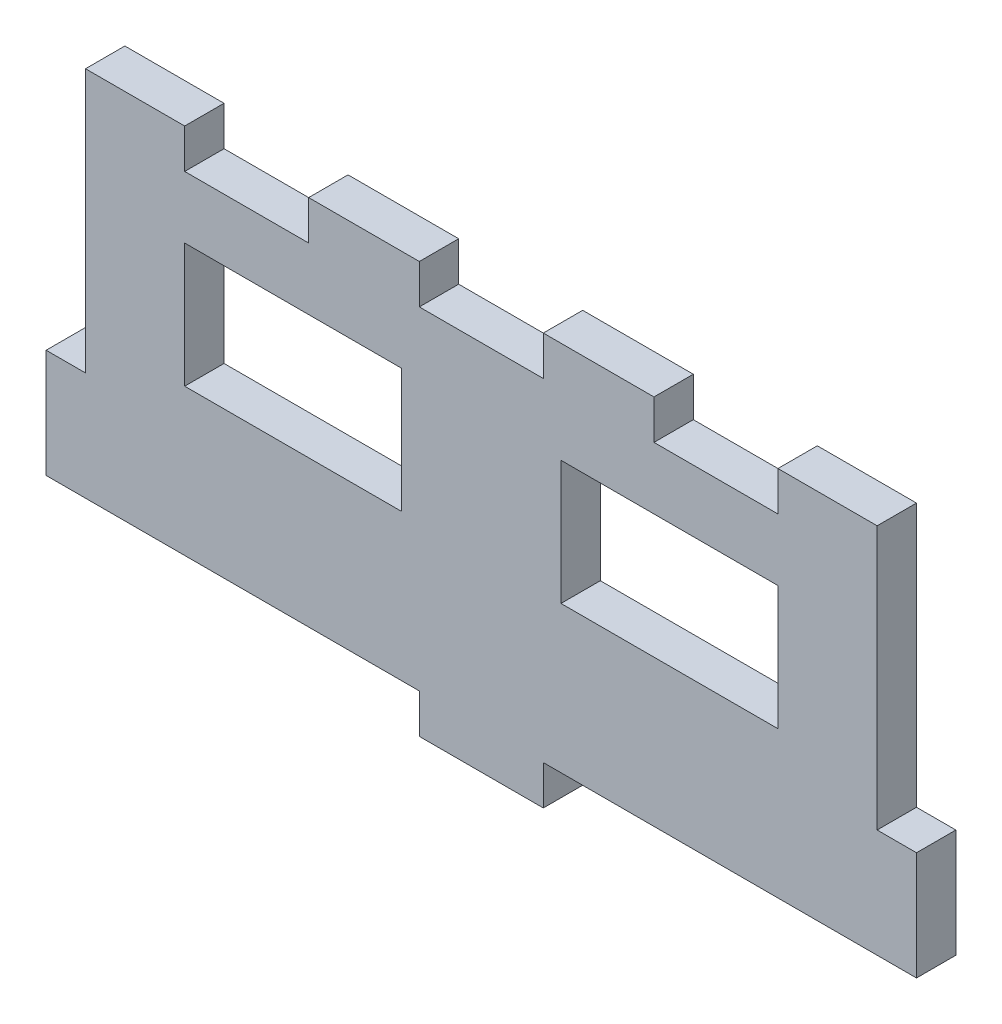
ISO-10303-21;
HEADER;
FILE_DESCRIPTION(('STEP AP214'),'2;1');
FILE_NAME('part.step','',(''),(''),'','','');
FILE_SCHEMA(('AUTOMOTIVE_DESIGN { 1 0 10303 214 1 1 1 1 }'));
ENDSEC;
DATA;
#1=APPLICATION_CONTEXT('core data for automotive mechanical design processes');
#2=APPLICATION_PROTOCOL_DEFINITION('international standard','automotive_design',2000,#1);
#3=PRODUCT_CONTEXT('',#1,'mechanical');
#4=PRODUCT('Part','Part','',(#3));
#5=PRODUCT_RELATED_PRODUCT_CATEGORY('part','',(#4));
#6=PRODUCT_DEFINITION_FORMATION('','',#4);
#7=PRODUCT_DEFINITION_CONTEXT('part definition',#1,'design');
#8=PRODUCT_DEFINITION('design','',#6,#7);
#9=PRODUCT_DEFINITION_SHAPE('','',#8);
#10=(LENGTH_UNIT() NAMED_UNIT(*) SI_UNIT(.MILLI.,.METRE.));
#11=(NAMED_UNIT(*) PLANE_ANGLE_UNIT() SI_UNIT($,.RADIAN.));
#12=(NAMED_UNIT(*) SI_UNIT($,.STERADIAN.) SOLID_ANGLE_UNIT());
#13=UNCERTAINTY_MEASURE_WITH_UNIT(LENGTH_MEASURE(1.E-05),#10,'distance_accuracy_value','');
#14=(GEOMETRIC_REPRESENTATION_CONTEXT(3) GLOBAL_UNCERTAINTY_ASSIGNED_CONTEXT((#13)) GLOBAL_UNIT_ASSIGNED_CONTEXT((#10,
#11,#12)) REPRESENTATION_CONTEXT('',''));
#15=CARTESIAN_POINT('',(0.,0.,0.));
#16=DIRECTION('',(0.,0.,1.));
#17=DIRECTION('',(1.,0.,0.));
#18=AXIS2_PLACEMENT_3D('',#15,#16,#17);
#19=CARTESIAN_POINT('',(-127.7,60.,12.7));
#20=DIRECTION('',(0.,1.,0.));
#21=DIRECTION('',(0.,0.,1.));
#22=AXIS2_PLACEMENT_3D('',#19,#20,#21);
#23=PLANE('',#22);
#24=DIRECTION('',(0.,0.,1.));
#25=VECTOR('',#24,1.);
#26=CARTESIAN_POINT('',(-95.7,60.,0.));
#27=LINE('',#26,#25);
#28=CARTESIAN_POINT('',(-95.7,60.,0.));
#29=VERTEX_POINT('',#28);
#30=CARTESIAN_POINT('',(-95.7,60.,12.7));
#31=VERTEX_POINT('',#30);
#32=EDGE_CURVE('E406',#29,#31,#27,.T.);
#33=ORIENTED_EDGE('',*,*,#32,.F.);
#34=DIRECTION('',(1.,0.,0.));
#35=VECTOR('',#34,1.);
#36=CARTESIAN_POINT('',(-127.7,60.,0.));
#37=LINE('',#36,#35);
#38=CARTESIAN_POINT('',(-127.7,60.,0.));
#39=VERTEX_POINT('',#38);
#40=EDGE_CURVE('E447',#39,#29,#37,.T.);
#41=ORIENTED_EDGE('',*,*,#40,.F.);
#42=DIRECTION('',(0.,0.,-1.));
#43=VECTOR('',#42,1.);
#44=CARTESIAN_POINT('',(-127.7,60.,12.7));
#45=LINE('',#44,#43);
#46=CARTESIAN_POINT('',(-127.7,60.,12.7));
#47=VERTEX_POINT('',#46);
#48=EDGE_CURVE('E458',#47,#39,#45,.T.);
#49=ORIENTED_EDGE('',*,*,#48,.F.);
#50=DIRECTION('',(1.,0.,0.));
#51=VECTOR('',#50,1.);
#52=CARTESIAN_POINT('',(-127.7,60.,12.7));
#53=LINE('',#52,#51);
#54=EDGE_CURVE('E455',#47,#31,#53,.T.);
#55=ORIENTED_EDGE('',*,*,#54,.T.);
#56=EDGE_LOOP('',(#33,#41,#49,#55));
#57=FACE_BOUND('',#56,.T.);
#58=ADVANCED_FACE('F87',(#57),#23,.T.);
#59=DIRECTION('',(0.,0.,1.));
#60=VECTOR('',#59,1.);
#61=CARTESIAN_POINT('',(55.7,60.,0.));
#62=LINE('',#61,#60);
#63=CARTESIAN_POINT('',(55.7,60.,0.));
#64=VERTEX_POINT('',#63);
#65=CARTESIAN_POINT('',(55.7,60.,12.7));
#66=VERTEX_POINT('',#65);
#67=EDGE_CURVE('E345',#64,#66,#62,.T.);
#68=ORIENTED_EDGE('',*,*,#67,.F.);
#69=CARTESIAN_POINT('',(20.,60.,0.));
#70=VERTEX_POINT('',#69);
#71=EDGE_CURVE('E476',#70,#64,#37,.T.);
#72=ORIENTED_EDGE('',*,*,#71,.F.);
#73=DIRECTION('',(0.,0.,1.));
#74=VECTOR('',#73,1.);
#75=CARTESIAN_POINT('',(20.,60.,0.));
#76=LINE('',#75,#74);
#77=CARTESIAN_POINT('',(20.,60.,12.7));
#78=VERTEX_POINT('',#77);
#79=EDGE_CURVE('E436',#70,#78,#76,.T.);
#80=ORIENTED_EDGE('',*,*,#79,.T.);
#81=EDGE_CURVE('E460',#78,#66,#53,.T.);
#82=ORIENTED_EDGE('',*,*,#81,.T.);
#83=EDGE_LOOP('',(#68,#72,#80,#82));
#84=FACE_BOUND('',#83,.T.);
#85=ADVANCED_FACE('F596',(#84),#23,.T.);
#86=DIRECTION('',(0.,0.,1.));
#87=VECTOR('',#86,1.);
#88=CARTESIAN_POINT('',(-55.7,60.,0.));
#89=LINE('',#88,#87);
#90=CARTESIAN_POINT('',(-55.7,60.,0.));
#91=VERTEX_POINT('',#90);
#92=CARTESIAN_POINT('',(-55.7,60.,12.7));
#93=VERTEX_POINT('',#92);
#94=EDGE_CURVE('E409',#91,#93,#89,.T.);
#95=ORIENTED_EDGE('',*,*,#94,.T.);
#96=CARTESIAN_POINT('',(-20.,60.,12.7));
#97=VERTEX_POINT('',#96);
#98=EDGE_CURVE('E459',#93,#97,#53,.T.);
#99=ORIENTED_EDGE('',*,*,#98,.T.);
#100=DIRECTION('',(0.,0.,1.));
#101=VECTOR('',#100,1.);
#102=CARTESIAN_POINT('',(-20.,60.,0.));
#103=LINE('',#102,#101);
#104=CARTESIAN_POINT('',(-20.,60.,0.));
#105=VERTEX_POINT('',#104);
#106=EDGE_CURVE('E432',#105,#97,#103,.T.);
#107=ORIENTED_EDGE('',*,*,#106,.F.);
#108=EDGE_CURVE('E475',#91,#105,#37,.T.);
#109=ORIENTED_EDGE('',*,*,#108,.F.);
#110=EDGE_LOOP('',(#95,#99,#107,#109));
#111=FACE_BOUND('',#110,.T.);
#112=ADVANCED_FACE('F569',(#111),#23,.T.);
#113=DIRECTION('',(0.,0.,1.));
#114=VECTOR('',#113,1.);
#115=CARTESIAN_POINT('',(95.7,60.,0.));
#116=LINE('',#115,#114);
#117=CARTESIAN_POINT('',(95.7,60.,0.));
#118=VERTEX_POINT('',#117);
#119=CARTESIAN_POINT('',(95.7,60.,12.7));
#120=VERTEX_POINT('',#119);
#121=EDGE_CURVE('E342',#118,#120,#116,.T.);
#122=ORIENTED_EDGE('',*,*,#121,.T.);
#123=CARTESIAN_POINT('',(127.7,60.,12.7));
#124=VERTEX_POINT('',#123);
#125=EDGE_CURVE('E454',#120,#124,#53,.T.);
#126=ORIENTED_EDGE('',*,*,#125,.T.);
#127=DIRECTION('',(0.,0.,-1.));
#128=VECTOR('',#127,1.);
#129=CARTESIAN_POINT('',(127.7,60.,12.7));
#130=LINE('',#129,#128);
#131=CARTESIAN_POINT('',(127.7,60.,0.));
#132=VERTEX_POINT('',#131);
#133=EDGE_CURVE('E478',#124,#132,#130,.T.);
#134=ORIENTED_EDGE('',*,*,#133,.T.);
#135=EDGE_CURVE('E472',#118,#132,#37,.T.);
#136=ORIENTED_EDGE('',*,*,#135,.F.);
#137=EDGE_LOOP('',(#122,#126,#134,#136));
#138=FACE_BOUND('',#137,.T.);
#139=ADVANCED_FACE('F563',(#138),#23,.T.);
#140=CARTESIAN_POINT('',(0.,0.,0.));
#141=DIRECTION('',(0.,0.,1.));
#142=DIRECTION('',(1.,0.,0.));
#143=AXIS2_PLACEMENT_3D('',#140,#141,#142);
#144=PLANE('',#143);
#145=ORIENTED_EDGE('',*,*,#71,.T.);
#146=DIRECTION('',(0.,-1.,0.));
#147=VECTOR('',#146,1.);
#148=CARTESIAN_POINT('',(55.7,60.,0.));
#149=LINE('',#148,#147);
#150=CARTESIAN_POINT('',(55.7,47.3,0.));
#151=VERTEX_POINT('',#150);
#152=EDGE_CURVE('E351',#64,#151,#149,.T.);
#153=ORIENTED_EDGE('',*,*,#152,.T.);
#154=DIRECTION('',(1.,0.,0.));
#155=VECTOR('',#154,1.);
#156=CARTESIAN_POINT('',(55.7,47.3,0.));
#157=LINE('',#156,#155);
#158=CARTESIAN_POINT('',(95.7,47.3,0.));
#159=VERTEX_POINT('',#158);
#160=EDGE_CURVE('E359',#151,#159,#157,.T.);
#161=ORIENTED_EDGE('',*,*,#160,.T.);
#162=DIRECTION('',(0.,1.,0.));
#163=VECTOR('',#162,1.);
#164=CARTESIAN_POINT('',(95.7,60.,0.));
#165=LINE('',#164,#163);
#166=EDGE_CURVE('E339',#159,#118,#165,.T.);
#167=ORIENTED_EDGE('',*,*,#166,.T.);
#168=ORIENTED_EDGE('',*,*,#135,.T.);
#169=DIRECTION('',(0.,-1.,0.));
#170=VECTOR('',#169,1.);
#171=CARTESIAN_POINT('',(127.7,60.,0.));
#172=LINE('',#171,#170);
#173=CARTESIAN_POINT('',(127.7,-25.,0.));
#174=VERTEX_POINT('',#173);
#175=EDGE_CURVE('E469',#132,#174,#172,.T.);
#176=ORIENTED_EDGE('',*,*,#175,.T.);
#177=DIRECTION('',(1.,0.,0.));
#178=VECTOR('',#177,1.);
#179=CARTESIAN_POINT('',(127.7,-25.,0.));
#180=LINE('',#179,#178);
#181=CARTESIAN_POINT('',(140.4,-25.,0.));
#182=VERTEX_POINT('',#181);
#183=EDGE_CURVE('E525',#174,#182,#180,.T.);
#184=ORIENTED_EDGE('',*,*,#183,.T.);
#185=DIRECTION('',(0.,1.,0.));
#186=VECTOR('',#185,1.);
#187=CARTESIAN_POINT('',(140.4,-60.,0.));
#188=LINE('',#187,#186);
#189=CARTESIAN_POINT('',(140.4,-60.,0.));
#190=VERTEX_POINT('',#189);
#191=EDGE_CURVE('E435',#190,#182,#188,.T.);
#192=ORIENTED_EDGE('',*,*,#191,.F.);
#193=DIRECTION('',(1.,0.,0.));
#194=VECTOR('',#193,1.);
#195=CARTESIAN_POINT('',(-127.7,-60.,0.));
#196=LINE('',#195,#194);
#197=CARTESIAN_POINT('',(20.,-60.,0.));
#198=VERTEX_POINT('',#197);
#199=EDGE_CURVE('E464',#198,#190,#196,.T.);
#200=ORIENTED_EDGE('',*,*,#199,.F.);
#201=DIRECTION('',(0.,-1.,0.));
#202=VECTOR('',#201,1.);
#203=CARTESIAN_POINT('',(20.,-60.,0.));
#204=LINE('',#203,#202);
#205=CARTESIAN_POINT('',(20.,-72.7,0.));
#206=VERTEX_POINT('',#205);
#207=EDGE_CURVE('E486',#198,#206,#204,.T.);
#208=ORIENTED_EDGE('',*,*,#207,.T.);
#209=DIRECTION('',(1.,0.,0.));
#210=VECTOR('',#209,1.);
#211=CARTESIAN_POINT('',(-20.,-72.7,0.));
#212=LINE('',#211,#210);
#213=CARTESIAN_POINT('',(-20.,-72.7,0.));
#214=VERTEX_POINT('',#213);
#215=EDGE_CURVE('E495',#214,#206,#212,.T.);
#216=ORIENTED_EDGE('',*,*,#215,.F.);
#217=DIRECTION('',(0.,-1.,0.));
#218=VECTOR('',#217,1.);
#219=CARTESIAN_POINT('',(-20.,-60.,0.));
#220=LINE('',#219,#218);
#221=CARTESIAN_POINT('',(-20.,-60.,0.));
#222=VERTEX_POINT('',#221);
#223=EDGE_CURVE('E492',#222,#214,#220,.T.);
#224=ORIENTED_EDGE('',*,*,#223,.F.);
#225=CARTESIAN_POINT('',(-140.4,-60.,0.));
#226=VERTEX_POINT('',#225);
#227=EDGE_CURVE('E466',#226,#222,#196,.T.);
#228=ORIENTED_EDGE('',*,*,#227,.F.);
#229=DIRECTION('',(0.,1.,0.));
#230=VECTOR('',#229,1.);
#231=CARTESIAN_POINT('',(-140.4,-60.,0.));
#232=LINE('',#231,#230);
#233=CARTESIAN_POINT('',(-140.4,-25.,0.));
#234=VERTEX_POINT('',#233);
#235=EDGE_CURVE('E510',#226,#234,#232,.T.);
#236=ORIENTED_EDGE('',*,*,#235,.T.);
#237=DIRECTION('',(-1.,0.,0.));
#238=VECTOR('',#237,1.);
#239=CARTESIAN_POINT('',(-127.7,-25.,0.));
#240=LINE('',#239,#238);
#241=CARTESIAN_POINT('',(-127.7,-25.,0.));
#242=VERTEX_POINT('',#241);
#243=EDGE_CURVE('E514',#242,#234,#240,.T.);
#244=ORIENTED_EDGE('',*,*,#243,.F.);
#245=DIRECTION('',(0.,-1.,0.));
#246=VECTOR('',#245,1.);
#247=CARTESIAN_POINT('',(-127.7,60.,0.));
#248=LINE('',#247,#246);
#249=EDGE_CURVE('E461',#39,#242,#248,.T.);
#250=ORIENTED_EDGE('',*,*,#249,.F.);
#251=ORIENTED_EDGE('',*,*,#40,.T.);
#252=DIRECTION('',(0.,-1.,0.));
#253=VECTOR('',#252,1.);
#254=CARTESIAN_POINT('',(-95.7,60.,0.));
#255=LINE('',#254,#253);
#256=CARTESIAN_POINT('',(-95.7,47.3,0.));
#257=VERTEX_POINT('',#256);
#258=EDGE_CURVE('E390',#29,#257,#255,.T.);
#259=ORIENTED_EDGE('',*,*,#258,.T.);
#260=DIRECTION('',(1.,0.,0.));
#261=VECTOR('',#260,1.);
#262=CARTESIAN_POINT('',(-95.7,47.3,0.));
#263=LINE('',#262,#261);
#264=CARTESIAN_POINT('',(-55.7,47.3,0.));
#265=VERTEX_POINT('',#264);
#266=EDGE_CURVE('E393',#257,#265,#263,.T.);
#267=ORIENTED_EDGE('',*,*,#266,.T.);
#268=DIRECTION('',(0.,1.,0.));
#269=VECTOR('',#268,1.);
#270=CARTESIAN_POINT('',(-55.7,60.,0.));
#271=LINE('',#270,#269);
#272=EDGE_CURVE('E397',#265,#91,#271,.T.);
#273=ORIENTED_EDGE('',*,*,#272,.T.);
#274=ORIENTED_EDGE('',*,*,#108,.T.);
#275=DIRECTION('',(0.,-1.,0.));
#276=VECTOR('',#275,1.);
#277=CARTESIAN_POINT('',(-20.,60.,0.));
#278=LINE('',#277,#276);
#279=CARTESIAN_POINT('',(-20.,47.3,0.));
#280=VERTEX_POINT('',#279);
#281=EDGE_CURVE('E416',#105,#280,#278,.T.);
#282=ORIENTED_EDGE('',*,*,#281,.T.);
#283=DIRECTION('',(1.,0.,0.));
#284=VECTOR('',#283,1.);
#285=CARTESIAN_POINT('',(-20.,47.3,0.));
#286=LINE('',#285,#284);
#287=CARTESIAN_POINT('',(20.,47.3,0.));
#288=VERTEX_POINT('',#287);
#289=EDGE_CURVE('E419',#280,#288,#286,.T.);
#290=ORIENTED_EDGE('',*,*,#289,.T.);
#291=DIRECTION('',(0.,1.,0.));
#292=VECTOR('',#291,1.);
#293=CARTESIAN_POINT('',(20.,60.,0.));
#294=LINE('',#293,#292);
#295=EDGE_CURVE('E423',#288,#70,#294,.T.);
#296=ORIENTED_EDGE('',*,*,#295,.T.);
#297=EDGE_LOOP('',(#145,#153,#161,#167,#168,#176,#184,#192,#200,#208,#216,#224,#228,#236,#244,
#250,#251,#259,#267,#273,#274,#282,#290,#296));
#298=FACE_BOUND('',#297,.T.);
#299=DIRECTION('',(-1.,0.,0.));
#300=VECTOR('',#299,1.);
#301=CARTESIAN_POINT('',(-95.7,27.3,0.));
#302=LINE('',#301,#300);
#303=CARTESIAN_POINT('',(-25.7,27.3,0.));
#304=VERTEX_POINT('',#303);
#305=CARTESIAN_POINT('',(-95.7,27.3,0.));
#306=VERTEX_POINT('',#305);
#307=EDGE_CURVE('E367',#304,#306,#302,.T.);
#308=ORIENTED_EDGE('',*,*,#307,.T.);
#309=DIRECTION('',(0.,-1.,0.));
#310=VECTOR('',#309,1.);
#311=CARTESIAN_POINT('',(-95.7,27.3,0.));
#312=LINE('',#311,#310);
#313=CARTESIAN_POINT('',(-95.7,-12.7,0.));
#314=VERTEX_POINT('',#313);
#315=EDGE_CURVE('E375',#306,#314,#312,.T.);
#316=ORIENTED_EDGE('',*,*,#315,.T.);
#317=DIRECTION('',(1.,0.,0.));
#318=VECTOR('',#317,1.);
#319=CARTESIAN_POINT('',(-95.7,-12.7,0.));
#320=LINE('',#319,#318);
#321=CARTESIAN_POINT('',(-25.7,-12.7,0.));
#322=VERTEX_POINT('',#321);
#323=EDGE_CURVE('E385',#314,#322,#320,.T.);
#324=ORIENTED_EDGE('',*,*,#323,.T.);
#325=DIRECTION('',(0.,1.,0.));
#326=VECTOR('',#325,1.);
#327=CARTESIAN_POINT('',(-25.7,27.3,0.));
#328=LINE('',#327,#326);
#329=EDGE_CURVE('E104',#322,#304,#328,.T.);
#330=ORIENTED_EDGE('',*,*,#329,.T.);
#331=EDGE_LOOP('',(#308,#316,#324,#330));
#332=FACE_BOUND('',#331,.T.);
#333=DIRECTION('',(-1.,0.,0.));
#334=VECTOR('',#333,1.);
#335=CARTESIAN_POINT('',(25.7,27.3,0.));
#336=LINE('',#335,#334);
#337=CARTESIAN_POINT('',(95.7,27.3,0.));
#338=VERTEX_POINT('',#337);
#339=CARTESIAN_POINT('',(25.7,27.3,0.));
#340=VERTEX_POINT('',#339);
#341=EDGE_CURVE('E328',#338,#340,#336,.T.);
#342=ORIENTED_EDGE('',*,*,#341,.T.);
#343=DIRECTION('',(0.,-1.,0.));
#344=VECTOR('',#343,1.);
#345=CARTESIAN_POINT('',(25.7,27.3,0.));
#346=LINE('',#345,#344);
#347=CARTESIAN_POINT('',(25.7,-12.7,0.));
#348=VERTEX_POINT('',#347);
#349=EDGE_CURVE('E303',#340,#348,#346,.T.);
#350=ORIENTED_EDGE('',*,*,#349,.T.);
#351=DIRECTION('',(1.,0.,0.));
#352=VECTOR('',#351,1.);
#353=CARTESIAN_POINT('',(25.7,-12.7,0.));
#354=LINE('',#353,#352);
#355=CARTESIAN_POINT('',(95.7,-12.7,0.));
#356=VERTEX_POINT('',#355);
#357=EDGE_CURVE('E332',#348,#356,#354,.T.);
#358=ORIENTED_EDGE('',*,*,#357,.T.);
#359=DIRECTION('',(0.,1.,0.));
#360=VECTOR('',#359,1.);
#361=CARTESIAN_POINT('',(95.7,27.3,0.));
#362=LINE('',#361,#360);
#363=EDGE_CURVE('E112',#356,#338,#362,.T.);
#364=ORIENTED_EDGE('',*,*,#363,.T.);
#365=EDGE_LOOP('',(#342,#350,#358,#364));
#366=FACE_BOUND('',#365,.T.);
#367=ADVANCED_FACE('F548',(#298,#332,#366),#144,.F.);
#368=CARTESIAN_POINT('',(0.,0.,12.7));
#369=DIRECTION('',(0.,0.,1.));
#370=DIRECTION('',(1.,0.,0.));
#371=AXIS2_PLACEMENT_3D('',#368,#369,#370);
#372=PLANE('',#371);
#373=DIRECTION('',(0.,-1.,0.));
#374=VECTOR('',#373,1.);
#375=CARTESIAN_POINT('',(55.7,60.,12.7));
#376=LINE('',#375,#374);
#377=CARTESIAN_POINT('',(55.7,47.3,12.7));
#378=VERTEX_POINT('',#377);
#379=EDGE_CURVE('E354',#66,#378,#376,.T.);
#380=ORIENTED_EDGE('',*,*,#379,.F.);
#381=ORIENTED_EDGE('',*,*,#81,.F.);
#382=DIRECTION('',(0.,1.,0.));
#383=VECTOR('',#382,1.);
#384=CARTESIAN_POINT('',(20.,60.,12.7));
#385=LINE('',#384,#383);
#386=CARTESIAN_POINT('',(20.,47.3,12.7));
#387=VERTEX_POINT('',#386);
#388=EDGE_CURVE('E420',#387,#78,#385,.T.);
#389=ORIENTED_EDGE('',*,*,#388,.F.);
#390=DIRECTION('',(1.,0.,0.));
#391=VECTOR('',#390,1.);
#392=CARTESIAN_POINT('',(-20.,47.3,12.7));
#393=LINE('',#392,#391);
#394=CARTESIAN_POINT('',(-20.,47.3,12.7));
#395=VERTEX_POINT('',#394);
#396=EDGE_CURVE('E428',#395,#387,#393,.T.);
#397=ORIENTED_EDGE('',*,*,#396,.F.);
#398=DIRECTION('',(0.,-1.,0.));
#399=VECTOR('',#398,1.);
#400=CARTESIAN_POINT('',(-20.,60.,12.7));
#401=LINE('',#400,#399);
#402=EDGE_CURVE('E408',#97,#395,#401,.T.);
#403=ORIENTED_EDGE('',*,*,#402,.F.);
#404=ORIENTED_EDGE('',*,*,#98,.F.);
#405=DIRECTION('',(0.,1.,0.));
#406=VECTOR('',#405,1.);
#407=CARTESIAN_POINT('',(-55.7,60.,12.7));
#408=LINE('',#407,#406);
#409=CARTESIAN_POINT('',(-55.7,47.3,12.7));
#410=VERTEX_POINT('',#409);
#411=EDGE_CURVE('E394',#410,#93,#408,.T.);
#412=ORIENTED_EDGE('',*,*,#411,.F.);
#413=DIRECTION('',(1.,0.,0.));
#414=VECTOR('',#413,1.);
#415=CARTESIAN_POINT('',(-95.7,47.3,12.7));
#416=LINE('',#415,#414);
#417=CARTESIAN_POINT('',(-95.7,47.3,12.7));
#418=VERTEX_POINT('',#417);
#419=EDGE_CURVE('E402',#418,#410,#416,.T.);
#420=ORIENTED_EDGE('',*,*,#419,.F.);
#421=DIRECTION('',(0.,-1.,0.));
#422=VECTOR('',#421,1.);
#423=CARTESIAN_POINT('',(-95.7,60.,12.7));
#424=LINE('',#423,#422);
#425=EDGE_CURVE('E356',#31,#418,#424,.T.);
#426=ORIENTED_EDGE('',*,*,#425,.F.);
#427=ORIENTED_EDGE('',*,*,#54,.F.);
#428=DIRECTION('',(0.,-1.,0.));
#429=VECTOR('',#428,1.);
#430=CARTESIAN_POINT('',(-127.7,60.,12.7));
#431=LINE('',#430,#429);
#432=CARTESIAN_POINT('',(-127.7,-25.,12.7));
#433=VERTEX_POINT('',#432);
#434=EDGE_CURVE('E443',#47,#433,#431,.T.);
#435=ORIENTED_EDGE('',*,*,#434,.T.);
#436=DIRECTION('',(-1.,0.,0.));
#437=VECTOR('',#436,1.);
#438=CARTESIAN_POINT('',(-127.7,-25.,12.7));
#439=LINE('',#438,#437);
#440=CARTESIAN_POINT('',(-140.4,-25.,12.7));
#441=VERTEX_POINT('',#440);
#442=EDGE_CURVE('E507',#433,#441,#439,.T.);
#443=ORIENTED_EDGE('',*,*,#442,.T.);
#444=DIRECTION('',(0.,1.,0.));
#445=VECTOR('',#444,1.);
#446=CARTESIAN_POINT('',(-140.4,-60.,12.7));
#447=LINE('',#446,#445);
#448=CARTESIAN_POINT('',(-140.4,-60.,12.7));
#449=VERTEX_POINT('',#448);
#450=EDGE_CURVE('E509',#449,#441,#447,.T.);
#451=ORIENTED_EDGE('',*,*,#450,.F.);
#452=DIRECTION('',(1.,0.,0.));
#453=VECTOR('',#452,1.);
#454=CARTESIAN_POINT('',(-127.7,-60.,12.7));
#455=LINE('',#454,#453);
#456=CARTESIAN_POINT('',(-20.,-60.,12.7));
#457=VERTEX_POINT('',#456);
#458=EDGE_CURVE('E448',#449,#457,#455,.T.);
#459=ORIENTED_EDGE('',*,*,#458,.T.);
#460=DIRECTION('',(0.,-1.,0.));
#461=VECTOR('',#460,1.);
#462=CARTESIAN_POINT('',(-20.,-60.,12.7));
#463=LINE('',#462,#461);
#464=CARTESIAN_POINT('',(-20.,-72.7,12.7));
#465=VERTEX_POINT('',#464);
#466=EDGE_CURVE('E482',#457,#465,#463,.T.);
#467=ORIENTED_EDGE('',*,*,#466,.T.);
#468=DIRECTION('',(1.,0.,0.));
#469=VECTOR('',#468,1.);
#470=CARTESIAN_POINT('',(-20.,-72.7,12.7));
#471=LINE('',#470,#469);
#472=CARTESIAN_POINT('',(20.,-72.7,12.7));
#473=VERTEX_POINT('',#472);
#474=EDGE_CURVE('E485',#465,#473,#471,.T.);
#475=ORIENTED_EDGE('',*,*,#474,.T.);
#476=DIRECTION('',(0.,-1.,0.));
#477=VECTOR('',#476,1.);
#478=CARTESIAN_POINT('',(20.,-60.,12.7));
#479=LINE('',#478,#477);
#480=CARTESIAN_POINT('',(20.,-60.,12.7));
#481=VERTEX_POINT('',#480);
#482=EDGE_CURVE('E488',#481,#473,#479,.T.);
#483=ORIENTED_EDGE('',*,*,#482,.F.);
#484=CARTESIAN_POINT('',(140.4,-60.,12.7));
#485=VERTEX_POINT('',#484);
#486=EDGE_CURVE('E446',#481,#485,#455,.T.);
#487=ORIENTED_EDGE('',*,*,#486,.T.);
#488=DIRECTION('',(0.,1.,0.));
#489=VECTOR('',#488,1.);
#490=CARTESIAN_POINT('',(140.4,-60.,12.7));
#491=LINE('',#490,#489);
#492=CARTESIAN_POINT('',(140.4,-25.,12.7));
#493=VERTEX_POINT('',#492);
#494=EDGE_CURVE('E522',#485,#493,#491,.T.);
#495=ORIENTED_EDGE('',*,*,#494,.T.);
#496=DIRECTION('',(1.,0.,0.));
#497=VECTOR('',#496,1.);
#498=CARTESIAN_POINT('',(127.7,-25.,12.7));
#499=LINE('',#498,#497);
#500=CARTESIAN_POINT('',(127.7,-25.,12.7));
#501=VERTEX_POINT('',#500);
#502=EDGE_CURVE('E524',#501,#493,#499,.T.);
#503=ORIENTED_EDGE('',*,*,#502,.F.);
#504=DIRECTION('',(0.,-1.,0.));
#505=VECTOR('',#504,1.);
#506=CARTESIAN_POINT('',(127.7,60.,12.7));
#507=LINE('',#506,#505);
#508=EDGE_CURVE('E451',#124,#501,#507,.T.);
#509=ORIENTED_EDGE('',*,*,#508,.F.);
#510=ORIENTED_EDGE('',*,*,#125,.F.);
#511=DIRECTION('',(0.,1.,0.));
#512=VECTOR('',#511,1.);
#513=CARTESIAN_POINT('',(95.7,60.,12.7));
#514=LINE('',#513,#512);
#515=CARTESIAN_POINT('',(95.7,47.3,12.7));
#516=VERTEX_POINT('',#515);
#517=EDGE_CURVE('E348',#516,#120,#514,.T.);
#518=ORIENTED_EDGE('',*,*,#517,.F.);
#519=DIRECTION('',(1.,0.,0.));
#520=VECTOR('',#519,1.);
#521=CARTESIAN_POINT('',(55.7,47.3,12.7));
#522=LINE('',#521,#520);
#523=EDGE_CURVE('E350',#378,#516,#522,.T.);
#524=ORIENTED_EDGE('',*,*,#523,.F.);
#525=EDGE_LOOP('',(#380,#381,#389,#397,#403,#404,#412,#420,#426,#427,#435,#443,#451,#459,#467,
#475,#483,#487,#495,#503,#509,#510,#518,#524));
#526=FACE_BOUND('',#525,.T.);
#527=DIRECTION('',(0.,-1.,0.));
#528=VECTOR('',#527,1.);
#529=CARTESIAN_POINT('',(-95.7,27.3,12.7));
#530=LINE('',#529,#528);
#531=CARTESIAN_POINT('',(-95.7,27.3,12.7));
#532=VERTEX_POINT('',#531);
#533=CARTESIAN_POINT('',(-95.7,-12.7,12.7));
#534=VERTEX_POINT('',#533);
#535=EDGE_CURVE('E347',#532,#534,#530,.T.);
#536=ORIENTED_EDGE('',*,*,#535,.F.);
#537=DIRECTION('',(-1.,0.,0.));
#538=VECTOR('',#537,1.);
#539=CARTESIAN_POINT('',(-95.7,27.3,12.7));
#540=LINE('',#539,#538);
#541=CARTESIAN_POINT('',(-25.7,27.3,12.7));
#542=VERTEX_POINT('',#541);
#543=EDGE_CURVE('E371',#542,#532,#540,.T.);
#544=ORIENTED_EDGE('',*,*,#543,.F.);
#545=DIRECTION('',(0.,1.,0.));
#546=VECTOR('',#545,1.);
#547=CARTESIAN_POINT('',(-25.7,27.3,12.7));
#548=LINE('',#547,#546);
#549=CARTESIAN_POINT('',(-25.7,-12.7,12.7));
#550=VERTEX_POINT('',#549);
#551=EDGE_CURVE('E374',#550,#542,#548,.T.);
#552=ORIENTED_EDGE('',*,*,#551,.F.);
#553=DIRECTION('',(1.,0.,0.));
#554=VECTOR('',#553,1.);
#555=CARTESIAN_POINT('',(-95.7,-12.7,12.7));
#556=LINE('',#555,#554);
#557=EDGE_CURVE('E378',#534,#550,#556,.T.);
#558=ORIENTED_EDGE('',*,*,#557,.F.);
#559=EDGE_LOOP('',(#536,#544,#552,#558));
#560=FACE_BOUND('',#559,.T.);
#561=DIRECTION('',(0.,-1.,0.));
#562=VECTOR('',#561,1.);
#563=CARTESIAN_POINT('',(25.7,27.3,12.7));
#564=LINE('',#563,#562);
#565=CARTESIAN_POINT('',(25.7,27.3,12.7));
#566=VERTEX_POINT('',#565);
#567=CARTESIAN_POINT('',(25.7,-12.7,12.7));
#568=VERTEX_POINT('',#567);
#569=EDGE_CURVE('E300',#566,#568,#564,.T.);
#570=ORIENTED_EDGE('',*,*,#569,.F.);
#571=DIRECTION('',(-1.,0.,0.));
#572=VECTOR('',#571,1.);
#573=CARTESIAN_POINT('',(25.7,27.3,12.7));
#574=LINE('',#573,#572);
#575=CARTESIAN_POINT('',(95.7,27.3,12.7));
#576=VERTEX_POINT('',#575);
#577=EDGE_CURVE('E310',#576,#566,#574,.T.);
#578=ORIENTED_EDGE('',*,*,#577,.F.);
#579=DIRECTION('',(0.,1.,0.));
#580=VECTOR('',#579,1.);
#581=CARTESIAN_POINT('',(95.7,27.3,12.7));
#582=LINE('',#581,#580);
#583=CARTESIAN_POINT('',(95.7,-12.7,12.7));
#584=VERTEX_POINT('',#583);
#585=EDGE_CURVE('E315',#584,#576,#582,.T.);
#586=ORIENTED_EDGE('',*,*,#585,.F.);
#587=DIRECTION('',(1.,0.,0.));
#588=VECTOR('',#587,1.);
#589=CARTESIAN_POINT('',(25.7,-12.7,12.7));
#590=LINE('',#589,#588);
#591=EDGE_CURVE('E320',#568,#584,#590,.T.);
#592=ORIENTED_EDGE('',*,*,#591,.F.);
#593=EDGE_LOOP('',(#570,#578,#586,#592));
#594=FACE_BOUND('',#593,.T.);
#595=ADVANCED_FACE('F318',(#526,#560,#594),#372,.T.);
#596=CARTESIAN_POINT('',(127.7,60.,12.7));
#597=DIRECTION('',(1.,0.,0.));
#598=DIRECTION('',(0.,0.,-1.));
#599=AXIS2_PLACEMENT_3D('',#596,#597,#598);
#600=PLANE('',#599);
#601=ORIENTED_EDGE('',*,*,#508,.T.);
#602=DIRECTION('',(0.,0.,-1.));
#603=VECTOR('',#602,1.);
#604=CARTESIAN_POINT('',(127.7,-25.,12.7));
#605=LINE('',#604,#603);
#606=EDGE_CURVE('E481',#501,#174,#605,.T.);
#607=ORIENTED_EDGE('',*,*,#606,.T.);
#608=ORIENTED_EDGE('',*,*,#175,.F.);
#609=ORIENTED_EDGE('',*,*,#133,.F.);
#610=EDGE_LOOP('',(#601,#607,#608,#609));
#611=FACE_BOUND('',#610,.T.);
#612=ADVANCED_FACE('F560',(#611),#600,.T.);
#613=CARTESIAN_POINT('',(-127.7,-60.,12.7));
#614=DIRECTION('',(0.,1.,0.));
#615=DIRECTION('',(0.,0.,1.));
#616=AXIS2_PLACEMENT_3D('',#613,#614,#615);
#617=PLANE('',#616);
#618=ORIENTED_EDGE('',*,*,#486,.F.);
#619=DIRECTION('',(0.,0.,-1.));
#620=VECTOR('',#619,1.);
#621=CARTESIAN_POINT('',(20.,-60.,12.7));
#622=LINE('',#621,#620);
#623=EDGE_CURVE('E502',#481,#198,#622,.T.);
#624=ORIENTED_EDGE('',*,*,#623,.T.);
#625=ORIENTED_EDGE('',*,*,#199,.T.);
#626=DIRECTION('',(0.,0.,-1.));
#627=VECTOR('',#626,1.);
#628=CARTESIAN_POINT('',(140.4,-60.,12.7));
#629=LINE('',#628,#627);
#630=EDGE_CURVE('E91',#485,#190,#629,.T.);
#631=ORIENTED_EDGE('',*,*,#630,.F.);
#632=EDGE_LOOP('',(#618,#624,#625,#631));
#633=FACE_BOUND('',#632,.T.);
#634=ADVANCED_FACE('F543',(#633),#617,.F.);
#635=DIRECTION('',(0.,0.,-1.));
#636=VECTOR('',#635,1.);
#637=CARTESIAN_POINT('',(-20.,-60.,12.7));
#638=LINE('',#637,#636);
#639=EDGE_CURVE('E96',#457,#222,#638,.T.);
#640=ORIENTED_EDGE('',*,*,#639,.F.);
#641=ORIENTED_EDGE('',*,*,#458,.F.);
#642=DIRECTION('',(0.,0.,-1.));
#643=VECTOR('',#642,1.);
#644=CARTESIAN_POINT('',(-140.4,-60.,12.7));
#645=LINE('',#644,#643);
#646=EDGE_CURVE('E513',#449,#226,#645,.T.);
#647=ORIENTED_EDGE('',*,*,#646,.T.);
#648=ORIENTED_EDGE('',*,*,#227,.T.);
#649=EDGE_LOOP('',(#640,#641,#647,#648));
#650=FACE_BOUND('',#649,.T.);
#651=ADVANCED_FACE('F800',(#650),#617,.F.);
#652=CARTESIAN_POINT('',(-127.7,60.,12.7));
#653=DIRECTION('',(1.,0.,0.));
#654=DIRECTION('',(0.,0.,-1.));
#655=AXIS2_PLACEMENT_3D('',#652,#653,#654);
#656=PLANE('',#655);
#657=DIRECTION('',(0.,0.,-1.));
#658=VECTOR('',#657,1.);
#659=CARTESIAN_POINT('',(-127.7,-25.,12.7));
#660=LINE('',#659,#658);
#661=EDGE_CURVE('E12',#433,#242,#660,.T.);
#662=ORIENTED_EDGE('',*,*,#661,.F.);
#663=ORIENTED_EDGE('',*,*,#434,.F.);
#664=ORIENTED_EDGE('',*,*,#48,.T.);
#665=ORIENTED_EDGE('',*,*,#249,.T.);
#666=EDGE_LOOP('',(#662,#663,#664,#665));
#667=FACE_BOUND('',#666,.T.);
#668=ADVANCED_FACE('F809',(#667),#656,.F.);
#669=CARTESIAN_POINT('',(140.4,-60.,12.7));
#670=DIRECTION('',(-1.,0.,0.));
#671=DIRECTION('',(0.,0.,1.));
#672=AXIS2_PLACEMENT_3D('',#669,#670,#671);
#673=PLANE('',#672);
#674=ORIENTED_EDGE('',*,*,#191,.T.);
#675=DIRECTION('',(0.,0.,-1.));
#676=VECTOR('',#675,1.);
#677=CARTESIAN_POINT('',(140.4,-25.,12.7));
#678=LINE('',#677,#676);
#679=EDGE_CURVE('E528',#493,#182,#678,.T.);
#680=ORIENTED_EDGE('',*,*,#679,.F.);
#681=ORIENTED_EDGE('',*,*,#494,.F.);
#682=ORIENTED_EDGE('',*,*,#630,.T.);
#683=EDGE_LOOP('',(#674,#680,#681,#682));
#684=FACE_BOUND('',#683,.T.);
#685=ADVANCED_FACE('F89',(#684),#673,.F.);
#686=CARTESIAN_POINT('',(127.7,-25.,12.7));
#687=DIRECTION('',(0.,1.,0.));
#688=DIRECTION('',(-1.,0.,0.));
#689=AXIS2_PLACEMENT_3D('',#686,#687,#688);
#690=PLANE('',#689);
#691=ORIENTED_EDGE('',*,*,#183,.F.);
#692=ORIENTED_EDGE('',*,*,#606,.F.);
#693=ORIENTED_EDGE('',*,*,#502,.T.);
#694=ORIENTED_EDGE('',*,*,#679,.T.);
#695=EDGE_LOOP('',(#691,#692,#693,#694));
#696=FACE_BOUND('',#695,.T.);
#697=ADVANCED_FACE('F551',(#696),#690,.T.);
#698=CARTESIAN_POINT('',(-20.,-72.7,12.7));
#699=DIRECTION('',(0.,1.,0.));
#700=DIRECTION('',(-1.,0.,0.));
#701=AXIS2_PLACEMENT_3D('',#698,#699,#700);
#702=PLANE('',#701);
#703=ORIENTED_EDGE('',*,*,#215,.T.);
#704=DIRECTION('',(0.,0.,-1.));
#705=VECTOR('',#704,1.);
#706=CARTESIAN_POINT('',(20.,-72.7,12.7));
#707=LINE('',#706,#705);
#708=EDGE_CURVE('E491',#473,#206,#707,.T.);
#709=ORIENTED_EDGE('',*,*,#708,.F.);
#710=ORIENTED_EDGE('',*,*,#474,.F.);
#711=DIRECTION('',(0.,0.,-1.));
#712=VECTOR('',#711,1.);
#713=CARTESIAN_POINT('',(-20.,-72.7,12.7));
#714=LINE('',#713,#712);
#715=EDGE_CURVE('E465',#465,#214,#714,.T.);
#716=ORIENTED_EDGE('',*,*,#715,.T.);
#717=EDGE_LOOP('',(#703,#709,#710,#716));
#718=FACE_BOUND('',#717,.T.);
#719=ADVANCED_FACE('F832',(#718),#702,.F.);
#720=CARTESIAN_POINT('',(20.,-60.,12.7));
#721=DIRECTION('',(1.,0.,0.));
#722=DIRECTION('',(0.,1.,0.));
#723=AXIS2_PLACEMENT_3D('',#720,#721,#722);
#724=PLANE('',#723);
#725=ORIENTED_EDGE('',*,*,#207,.F.);
#726=ORIENTED_EDGE('',*,*,#623,.F.);
#727=ORIENTED_EDGE('',*,*,#482,.T.);
#728=ORIENTED_EDGE('',*,*,#708,.T.);
#729=EDGE_LOOP('',(#725,#726,#727,#728));
#730=FACE_BOUND('',#729,.T.);
#731=ADVANCED_FACE('F840',(#730),#724,.T.);
#732=CARTESIAN_POINT('',(-20.,-60.,12.7));
#733=DIRECTION('',(1.,0.,0.));
#734=DIRECTION('',(0.,1.,0.));
#735=AXIS2_PLACEMENT_3D('',#732,#733,#734);
#736=PLANE('',#735);
#737=ORIENTED_EDGE('',*,*,#223,.T.);
#738=ORIENTED_EDGE('',*,*,#715,.F.);
#739=ORIENTED_EDGE('',*,*,#466,.F.);
#740=ORIENTED_EDGE('',*,*,#639,.T.);
#741=EDGE_LOOP('',(#737,#738,#739,#740));
#742=FACE_BOUND('',#741,.T.);
#743=ADVANCED_FACE('F833',(#742),#736,.F.);
#744=CARTESIAN_POINT('',(-140.4,-60.,12.7));
#745=DIRECTION('',(-1.,0.,0.));
#746=DIRECTION('',(0.,0.,1.));
#747=AXIS2_PLACEMENT_3D('',#744,#745,#746);
#748=PLANE('',#747);
#749=ORIENTED_EDGE('',*,*,#235,.F.);
#750=ORIENTED_EDGE('',*,*,#646,.F.);
#751=ORIENTED_EDGE('',*,*,#450,.T.);
#752=DIRECTION('',(0.,0.,-1.));
#753=VECTOR('',#752,1.);
#754=CARTESIAN_POINT('',(-140.4,-25.,12.7));
#755=LINE('',#754,#753);
#756=EDGE_CURVE('E496',#441,#234,#755,.T.);
#757=ORIENTED_EDGE('',*,*,#756,.T.);
#758=EDGE_LOOP('',(#749,#750,#751,#757));
#759=FACE_BOUND('',#758,.T.);
#760=ADVANCED_FACE('F609',(#759),#748,.T.);
#761=CARTESIAN_POINT('',(-127.7,-25.,12.7));
#762=DIRECTION('',(0.,-1.,0.));
#763=DIRECTION('',(0.,0.,-1.));
#764=AXIS2_PLACEMENT_3D('',#761,#762,#763);
#765=PLANE('',#764);
#766=ORIENTED_EDGE('',*,*,#243,.T.);
#767=ORIENTED_EDGE('',*,*,#756,.F.);
#768=ORIENTED_EDGE('',*,*,#442,.F.);
#769=ORIENTED_EDGE('',*,*,#661,.T.);
#770=EDGE_LOOP('',(#766,#767,#768,#769));
#771=FACE_BOUND('',#770,.T.);
#772=ADVANCED_FACE('F607',(#771),#765,.F.);
#773=CARTESIAN_POINT('',(-20.,60.,0.));
#774=DIRECTION('',(-1.,0.,0.));
#775=DIRECTION('',(0.,0.,1.));
#776=AXIS2_PLACEMENT_3D('',#773,#774,#775);
#777=PLANE('',#776);
#778=ORIENTED_EDGE('',*,*,#402,.T.);
#779=DIRECTION('',(0.,0.,1.));
#780=VECTOR('',#779,1.);
#781=CARTESIAN_POINT('',(-20.,47.3,0.));
#782=LINE('',#781,#780);
#783=EDGE_CURVE('E426',#280,#395,#782,.T.);
#784=ORIENTED_EDGE('',*,*,#783,.F.);
#785=ORIENTED_EDGE('',*,*,#281,.F.);
#786=ORIENTED_EDGE('',*,*,#106,.T.);
#787=EDGE_LOOP('',(#778,#784,#785,#786));
#788=FACE_BOUND('',#787,.T.);
#789=ADVANCED_FACE('F575',(#788),#777,.F.);
#790=CARTESIAN_POINT('',(20.,60.,0.));
#791=DIRECTION('',(1.,0.,0.));
#792=DIRECTION('',(0.,1.,0.));
#793=AXIS2_PLACEMENT_3D('',#790,#791,#792);
#794=PLANE('',#793);
#795=ORIENTED_EDGE('',*,*,#388,.T.);
#796=ORIENTED_EDGE('',*,*,#79,.F.);
#797=ORIENTED_EDGE('',*,*,#295,.F.);
#798=DIRECTION('',(0.,0.,1.));
#799=VECTOR('',#798,1.);
#800=CARTESIAN_POINT('',(20.,47.3,0.));
#801=LINE('',#800,#799);
#802=EDGE_CURVE('E439',#288,#387,#801,.T.);
#803=ORIENTED_EDGE('',*,*,#802,.T.);
#804=EDGE_LOOP('',(#795,#796,#797,#803));
#805=FACE_BOUND('',#804,.T.);
#806=ADVANCED_FACE('F598',(#805),#794,.F.);
#807=CARTESIAN_POINT('',(-20.,47.3,0.));
#808=DIRECTION('',(0.,-1.,0.));
#809=DIRECTION('',(0.,0.,-1.));
#810=AXIS2_PLACEMENT_3D('',#807,#808,#809);
#811=PLANE('',#810);
#812=ORIENTED_EDGE('',*,*,#396,.T.);
#813=ORIENTED_EDGE('',*,*,#802,.F.);
#814=ORIENTED_EDGE('',*,*,#289,.F.);
#815=ORIENTED_EDGE('',*,*,#783,.T.);
#816=EDGE_LOOP('',(#812,#813,#814,#815));
#817=FACE_BOUND('',#816,.T.);
#818=ADVANCED_FACE('F580',(#817),#811,.F.);
#819=CARTESIAN_POINT('',(-95.7,60.,0.));
#820=DIRECTION('',(-1.,0.,0.));
#821=DIRECTION('',(0.,-1.,0.));
#822=AXIS2_PLACEMENT_3D('',#819,#820,#821);
#823=PLANE('',#822);
#824=ORIENTED_EDGE('',*,*,#425,.T.);
#825=DIRECTION('',(0.,0.,1.));
#826=VECTOR('',#825,1.);
#827=CARTESIAN_POINT('',(-95.7,47.3,0.));
#828=LINE('',#827,#826);
#829=EDGE_CURVE('E400',#257,#418,#828,.T.);
#830=ORIENTED_EDGE('',*,*,#829,.F.);
#831=ORIENTED_EDGE('',*,*,#258,.F.);
#832=ORIENTED_EDGE('',*,*,#32,.T.);
#833=EDGE_LOOP('',(#824,#830,#831,#832));
#834=FACE_BOUND('',#833,.T.);
#835=ADVANCED_FACE('F605',(#834),#823,.F.);
#836=CARTESIAN_POINT('',(-55.7,60.,0.));
#837=DIRECTION('',(1.,0.,0.));
#838=DIRECTION('',(0.,0.,-1.));
#839=AXIS2_PLACEMENT_3D('',#836,#837,#838);
#840=PLANE('',#839);
#841=ORIENTED_EDGE('',*,*,#411,.T.);
#842=ORIENTED_EDGE('',*,*,#94,.F.);
#843=ORIENTED_EDGE('',*,*,#272,.F.);
#844=DIRECTION('',(0.,0.,1.));
#845=VECTOR('',#844,1.);
#846=CARTESIAN_POINT('',(-55.7,47.3,0.));
#847=LINE('',#846,#845);
#848=EDGE_CURVE('E412',#265,#410,#847,.T.);
#849=ORIENTED_EDGE('',*,*,#848,.T.);
#850=EDGE_LOOP('',(#841,#842,#843,#849));
#851=FACE_BOUND('',#850,.T.);
#852=ADVANCED_FACE('F650',(#851),#840,.F.);
#853=CARTESIAN_POINT('',(-95.7,47.3,0.));
#854=DIRECTION('',(0.,-1.,0.));
#855=DIRECTION('',(1.,0.,0.));
#856=AXIS2_PLACEMENT_3D('',#853,#854,#855);
#857=PLANE('',#856);
#858=ORIENTED_EDGE('',*,*,#419,.T.);
#859=ORIENTED_EDGE('',*,*,#848,.F.);
#860=ORIENTED_EDGE('',*,*,#266,.F.);
#861=ORIENTED_EDGE('',*,*,#829,.T.);
#862=EDGE_LOOP('',(#858,#859,#860,#861));
#863=FACE_BOUND('',#862,.T.);
#864=ADVANCED_FACE('F658',(#863),#857,.F.);
#865=CARTESIAN_POINT('',(25.7,27.3,0.));
#866=DIRECTION('',(-1.,0.,0.));
#867=DIRECTION('',(0.,-1.,0.));
#868=AXIS2_PLACEMENT_3D('',#865,#866,#867);
#869=PLANE('',#868);
#870=ORIENTED_EDGE('',*,*,#569,.T.);
#871=DIRECTION('',(0.,0.,1.));
#872=VECTOR('',#871,1.);
#873=CARTESIAN_POINT('',(25.7,-12.7,0.));
#874=LINE('',#873,#872);
#875=EDGE_CURVE('E330',#348,#568,#874,.T.);
#876=ORIENTED_EDGE('',*,*,#875,.F.);
#877=ORIENTED_EDGE('',*,*,#349,.F.);
#878=DIRECTION('',(0.,0.,1.));
#879=VECTOR('',#878,1.);
#880=CARTESIAN_POINT('',(25.7,27.3,0.));
#881=LINE('',#880,#879);
#882=EDGE_CURVE('E296',#340,#566,#881,.T.);
#883=ORIENTED_EDGE('',*,*,#882,.T.);
#884=EDGE_LOOP('',(#870,#876,#877,#883));
#885=FACE_BOUND('',#884,.T.);
#886=ADVANCED_FACE('F298',(#885),#869,.F.);
#887=CARTESIAN_POINT('',(25.7,27.3,0.));
#888=DIRECTION('',(0.,1.,0.));
#889=DIRECTION('',(0.,0.,1.));
#890=AXIS2_PLACEMENT_3D('',#887,#888,#889);
#891=PLANE('',#890);
#892=ORIENTED_EDGE('',*,*,#577,.T.);
#893=ORIENTED_EDGE('',*,*,#882,.F.);
#894=ORIENTED_EDGE('',*,*,#341,.F.);
#895=DIRECTION('',(0.,0.,1.));
#896=VECTOR('',#895,1.);
#897=CARTESIAN_POINT('',(95.7,27.3,0.));
#898=LINE('',#897,#896);
#899=EDGE_CURVE('E307',#338,#576,#898,.T.);
#900=ORIENTED_EDGE('',*,*,#899,.T.);
#901=EDGE_LOOP('',(#892,#893,#894,#900));
#902=FACE_BOUND('',#901,.T.);
#903=ADVANCED_FACE('F311',(#902),#891,.F.);
#904=CARTESIAN_POINT('',(95.7,27.3,0.));
#905=DIRECTION('',(1.,0.,0.));
#906=DIRECTION('',(0.,1.,0.));
#907=AXIS2_PLACEMENT_3D('',#904,#905,#906);
#908=PLANE('',#907);
#909=ORIENTED_EDGE('',*,*,#585,.T.);
#910=ORIENTED_EDGE('',*,*,#899,.F.);
#911=ORIENTED_EDGE('',*,*,#363,.F.);
#912=DIRECTION('',(0.,0.,1.));
#913=VECTOR('',#912,1.);
#914=CARTESIAN_POINT('',(95.7,-12.7,0.));
#915=LINE('',#914,#913);
#916=EDGE_CURVE('E930',#356,#584,#915,.T.);
#917=ORIENTED_EDGE('',*,*,#916,.T.);
#918=EDGE_LOOP('',(#909,#910,#911,#917));
#919=FACE_BOUND('',#918,.T.);
#920=ADVANCED_FACE('F682',(#919),#908,.F.);
#921=CARTESIAN_POINT('',(25.7,-12.7,0.));
#922=DIRECTION('',(0.,-1.,0.));
#923=DIRECTION('',(0.,0.,-1.));
#924=AXIS2_PLACEMENT_3D('',#921,#922,#923);
#925=PLANE('',#924);
#926=ORIENTED_EDGE('',*,*,#591,.T.);
#927=ORIENTED_EDGE('',*,*,#916,.F.);
#928=ORIENTED_EDGE('',*,*,#357,.F.);
#929=ORIENTED_EDGE('',*,*,#875,.T.);
#930=EDGE_LOOP('',(#926,#927,#928,#929));
#931=FACE_BOUND('',#930,.T.);
#932=ADVANCED_FACE('F690',(#931),#925,.F.);
#933=CARTESIAN_POINT('',(-95.7,27.3,0.));
#934=DIRECTION('',(-1.,0.,0.));
#935=DIRECTION('',(0.,0.,1.));
#936=AXIS2_PLACEMENT_3D('',#933,#934,#935);
#937=PLANE('',#936);
#938=ORIENTED_EDGE('',*,*,#535,.T.);
#939=DIRECTION('',(0.,0.,1.));
#940=VECTOR('',#939,1.);
#941=CARTESIAN_POINT('',(-95.7,-12.7,0.));
#942=LINE('',#941,#940);
#943=EDGE_CURVE('E364',#314,#534,#942,.T.);
#944=ORIENTED_EDGE('',*,*,#943,.F.);
#945=ORIENTED_EDGE('',*,*,#315,.F.);
#946=DIRECTION('',(0.,0.,1.));
#947=VECTOR('',#946,1.);
#948=CARTESIAN_POINT('',(-95.7,27.3,0.));
#949=LINE('',#948,#947);
#950=EDGE_CURVE('E321',#306,#532,#949,.T.);
#951=ORIENTED_EDGE('',*,*,#950,.T.);
#952=EDGE_LOOP('',(#938,#944,#945,#951));
#953=FACE_BOUND('',#952,.T.);
#954=ADVANCED_FACE('F698',(#953),#937,.F.);
#955=CARTESIAN_POINT('',(-95.7,27.3,0.));
#956=DIRECTION('',(0.,1.,0.));
#957=DIRECTION('',(-1.,0.,0.));
#958=AXIS2_PLACEMENT_3D('',#955,#956,#957);
#959=PLANE('',#958);
#960=ORIENTED_EDGE('',*,*,#543,.T.);
#961=ORIENTED_EDGE('',*,*,#950,.F.);
#962=ORIENTED_EDGE('',*,*,#307,.F.);
#963=DIRECTION('',(0.,0.,1.));
#964=VECTOR('',#963,1.);
#965=CARTESIAN_POINT('',(-25.7,27.3,0.));
#966=LINE('',#965,#964);
#967=EDGE_CURVE('E323',#304,#542,#966,.T.);
#968=ORIENTED_EDGE('',*,*,#967,.T.);
#969=EDGE_LOOP('',(#960,#961,#962,#968));
#970=FACE_BOUND('',#969,.T.);
#971=ADVANCED_FACE('F707',(#970),#959,.F.);
#972=CARTESIAN_POINT('',(-25.7,27.3,0.));
#973=DIRECTION('',(1.,0.,0.));
#974=DIRECTION('',(0.,1.,0.));
#975=AXIS2_PLACEMENT_3D('',#972,#973,#974);
#976=PLANE('',#975);
#977=ORIENTED_EDGE('',*,*,#551,.T.);
#978=ORIENTED_EDGE('',*,*,#967,.F.);
#979=ORIENTED_EDGE('',*,*,#329,.F.);
#980=DIRECTION('',(0.,0.,1.));
#981=VECTOR('',#980,1.);
#982=CARTESIAN_POINT('',(-25.7,-12.7,0.));
#983=LINE('',#982,#981);
#984=EDGE_CURVE('E368',#322,#550,#983,.T.);
#985=ORIENTED_EDGE('',*,*,#984,.T.);
#986=EDGE_LOOP('',(#977,#978,#979,#985));
#987=FACE_BOUND('',#986,.T.);
#988=ADVANCED_FACE('F716',(#987),#976,.F.);
#989=CARTESIAN_POINT('',(-95.7,-12.7,0.));
#990=DIRECTION('',(0.,-1.,0.));
#991=DIRECTION('',(1.,0.,0.));
#992=AXIS2_PLACEMENT_3D('',#989,#990,#991);
#993=PLANE('',#992);
#994=ORIENTED_EDGE('',*,*,#557,.T.);
#995=ORIENTED_EDGE('',*,*,#984,.F.);
#996=ORIENTED_EDGE('',*,*,#323,.F.);
#997=ORIENTED_EDGE('',*,*,#943,.T.);
#998=EDGE_LOOP('',(#994,#995,#996,#997));
#999=FACE_BOUND('',#998,.T.);
#1000=ADVANCED_FACE('F725',(#999),#993,.F.);
#1001=CARTESIAN_POINT('',(55.7,60.,0.));
#1002=DIRECTION('',(-1.,0.,0.));
#1003=DIRECTION('',(0.,0.,1.));
#1004=AXIS2_PLACEMENT_3D('',#1001,#1002,#1003);
#1005=PLANE('',#1004);
#1006=ORIENTED_EDGE('',*,*,#379,.T.);
#1007=DIRECTION('',(0.,0.,1.));
#1008=VECTOR('',#1007,1.);
#1009=CARTESIAN_POINT('',(55.7,47.3,0.));
#1010=LINE('',#1009,#1008);
#1011=EDGE_CURVE('E336',#151,#378,#1010,.T.);
#1012=ORIENTED_EDGE('',*,*,#1011,.F.);
#1013=ORIENTED_EDGE('',*,*,#152,.F.);
#1014=ORIENTED_EDGE('',*,*,#67,.T.);
#1015=EDGE_LOOP('',(#1006,#1012,#1013,#1014));
#1016=FACE_BOUND('',#1015,.T.);
#1017=ADVANCED_FACE('F592',(#1016),#1005,.F.);
#1018=CARTESIAN_POINT('',(95.7,60.,0.));
#1019=DIRECTION('',(1.,0.,0.));
#1020=DIRECTION('',(0.,1.,0.));
#1021=AXIS2_PLACEMENT_3D('',#1018,#1019,#1020);
#1022=PLANE('',#1021);
#1023=ORIENTED_EDGE('',*,*,#517,.T.);
#1024=ORIENTED_EDGE('',*,*,#121,.F.);
#1025=ORIENTED_EDGE('',*,*,#166,.F.);
#1026=DIRECTION('',(0.,0.,1.));
#1027=VECTOR('',#1026,1.);
#1028=CARTESIAN_POINT('',(95.7,47.3,0.));
#1029=LINE('',#1028,#1027);
#1030=EDGE_CURVE('E340',#159,#516,#1029,.T.);
#1031=ORIENTED_EDGE('',*,*,#1030,.T.);
#1032=EDGE_LOOP('',(#1023,#1024,#1025,#1031));
#1033=FACE_BOUND('',#1032,.T.);
#1034=ADVANCED_FACE('F587',(#1033),#1022,.F.);
#1035=CARTESIAN_POINT('',(55.7,47.3,0.));
#1036=DIRECTION('',(0.,-1.,0.));
#1037=DIRECTION('',(0.,0.,-1.));
#1038=AXIS2_PLACEMENT_3D('',#1035,#1036,#1037);
#1039=PLANE('',#1038);
#1040=ORIENTED_EDGE('',*,*,#523,.T.);
#1041=ORIENTED_EDGE('',*,*,#1030,.F.);
#1042=ORIENTED_EDGE('',*,*,#160,.F.);
#1043=ORIENTED_EDGE('',*,*,#1011,.T.);
#1044=EDGE_LOOP('',(#1040,#1041,#1042,#1043));
#1045=FACE_BOUND('',#1044,.T.);
#1046=ADVANCED_FACE('F590',(#1045),#1039,.F.);
#1047=CLOSED_SHELL('',(#58,#85,#112,#139,#367,#595,#612,#634,#651,#668,#685,#697,#719,#731,#743,
#760,#772,#789,#806,#818,#835,#852,#864,#886,#903,#920,#932,#954,#971,#988,#1000,#1017,#1034,#1046));
#1048=MANIFOLD_SOLID_BREP('B2',#1047);
#1049=ADVANCED_BREP_SHAPE_REPRESENTATION('',(#18,#1048),#14);
#1050=SHAPE_DEFINITION_REPRESENTATION(#9,#1049);
ENDSEC;
END-ISO-10303-21;
